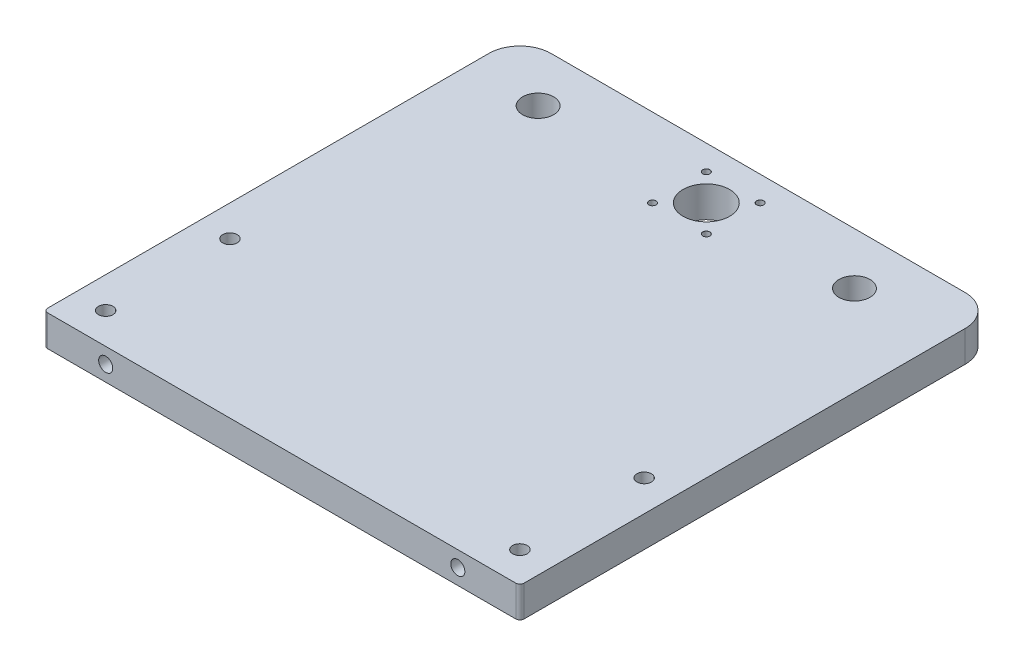
ISO-10303-21;
HEADER;
FILE_DESCRIPTION(('STEP AP214'),'2;1');
FILE_NAME('part.step','',(''),(''),'','','');
FILE_SCHEMA(('AUTOMOTIVE_DESIGN { 1 0 10303 214 1 1 1 1 }'));
ENDSEC;
DATA;
#1=APPLICATION_CONTEXT('core data for automotive mechanical design processes');
#2=APPLICATION_PROTOCOL_DEFINITION('international standard','automotive_design',2000,#1);
#3=PRODUCT_CONTEXT('',#1,'mechanical');
#4=PRODUCT('Part','Part','',(#3));
#5=PRODUCT_RELATED_PRODUCT_CATEGORY('part','',(#4));
#6=PRODUCT_DEFINITION_FORMATION('','',#4);
#7=PRODUCT_DEFINITION_CONTEXT('part definition',#1,'design');
#8=PRODUCT_DEFINITION('design','',#6,#7);
#9=PRODUCT_DEFINITION_SHAPE('','',#8);
#10=(LENGTH_UNIT() NAMED_UNIT(*) SI_UNIT(.MILLI.,.METRE.));
#11=(NAMED_UNIT(*) PLANE_ANGLE_UNIT() SI_UNIT($,.RADIAN.));
#12=(NAMED_UNIT(*) SI_UNIT($,.STERADIAN.) SOLID_ANGLE_UNIT());
#13=UNCERTAINTY_MEASURE_WITH_UNIT(LENGTH_MEASURE(1.E-05),#10,'distance_accuracy_value','');
#14=(GEOMETRIC_REPRESENTATION_CONTEXT(3) GLOBAL_UNCERTAINTY_ASSIGNED_CONTEXT((#13)) GLOBAL_UNIT_ASSIGNED_CONTEXT((#10,
#11,#12)) REPRESENTATION_CONTEXT('',''));
#15=CARTESIAN_POINT('',(0.,0.,0.));
#16=DIRECTION('',(0.,0.,1.));
#17=DIRECTION('',(1.,0.,0.));
#18=AXIS2_PLACEMENT_3D('',#15,#16,#17);
#19=CARTESIAN_POINT('',(-115.,15.,-115.));
#20=DIRECTION('',(1.,0.,0.));
#21=DIRECTION('',(0.,0.,-1.));
#22=AXIS2_PLACEMENT_3D('',#19,#20,#21);
#23=PLANE('',#22);
#24=DIRECTION('',(0.,0.,1.));
#25=VECTOR('',#24,1.);
#26=CARTESIAN_POINT('',(-115.,0.,-115.));
#27=LINE('',#26,#25);
#28=CARTESIAN_POINT('',(-115.,0.,-100.));
#29=VERTEX_POINT('',#28);
#30=CARTESIAN_POINT('',(-115.,0.,113.));
#31=VERTEX_POINT('',#30);
#32=EDGE_CURVE('E224',#29,#31,#27,.T.);
#33=ORIENTED_EDGE('',*,*,#32,.T.);
#34=DIRECTION('',(0.,-1.,0.));
#35=VECTOR('',#34,1.);
#36=CARTESIAN_POINT('',(-115.,15.,113.));
#37=LINE('',#36,#35);
#38=CARTESIAN_POINT('',(-115.,15.,113.));
#39=VERTEX_POINT('',#38);
#40=EDGE_CURVE('E11',#31,#39,#37,.F.);
#41=ORIENTED_EDGE('',*,*,#40,.T.);
#42=DIRECTION('',(0.,0.,1.));
#43=VECTOR('',#42,1.);
#44=CARTESIAN_POINT('',(-115.,15.,-115.));
#45=LINE('',#44,#43);
#46=CARTESIAN_POINT('',(-115.,15.,-100.));
#47=VERTEX_POINT('',#46);
#48=EDGE_CURVE('E225',#47,#39,#45,.T.);
#49=ORIENTED_EDGE('',*,*,#48,.F.);
#50=DIRECTION('',(0.,-1.,0.));
#51=VECTOR('',#50,1.);
#52=CARTESIAN_POINT('',(-115.,15.,-100.));
#53=LINE('',#52,#51);
#54=EDGE_CURVE('E262',#47,#29,#53,.T.);
#55=ORIENTED_EDGE('',*,*,#54,.T.);
#56=EDGE_LOOP('',(#33,#41,#49,#55));
#57=FACE_BOUND('',#56,.T.);
#58=ADVANCED_FACE('F41',(#57),#23,.F.);
#59=CARTESIAN_POINT('',(-115.,15.,115.));
#60=DIRECTION('',(0.,0.,-1.));
#61=DIRECTION('',(-1.,0.,0.));
#62=AXIS2_PLACEMENT_3D('',#59,#60,#61);
#63=PLANE('',#62);
#64=CARTESIAN_POINT('',(-85.,7.5,115.));
#65=DIRECTION('',(0.,0.,1.));
#66=DIRECTION('',(1.,0.,0.));
#67=AXIS2_PLACEMENT_3D('',#64,#65,#66);
#68=CIRCLE('',#67,3.39999999999999);
#69=CARTESIAN_POINT('',(-81.6,7.5,115.));
#70=VERTEX_POINT('',#69);
#71=EDGE_CURVE('E123',#70,#70,#68,.T.);
#72=ORIENTED_EDGE('',*,*,#71,.F.);
#73=EDGE_LOOP('',(#72));
#74=FACE_BOUND('',#73,.T.);
#75=CARTESIAN_POINT('',(85.,7.5,115.));
#76=DIRECTION('',(0.,0.,1.));
#77=DIRECTION('',(1.,0.,0.));
#78=AXIS2_PLACEMENT_3D('',#75,#76,#77);
#79=CIRCLE('',#78,3.39999999999999);
#80=CARTESIAN_POINT('',(88.4,7.5,115.));
#81=VERTEX_POINT('',#80);
#82=EDGE_CURVE('E122',#81,#81,#79,.T.);
#83=ORIENTED_EDGE('',*,*,#82,.F.);
#84=EDGE_LOOP('',(#83));
#85=FACE_BOUND('',#84,.T.);
#86=DIRECTION('',(1.,0.,0.));
#87=VECTOR('',#86,1.);
#88=CARTESIAN_POINT('',(-115.,0.,115.));
#89=LINE('',#88,#87);
#90=CARTESIAN_POINT('',(-113.,0.,115.));
#91=VERTEX_POINT('',#90);
#92=CARTESIAN_POINT('',(113.,0.,115.));
#93=VERTEX_POINT('',#92);
#94=EDGE_CURVE('E238',#91,#93,#89,.T.);
#95=ORIENTED_EDGE('',*,*,#94,.T.);
#96=DIRECTION('',(0.,-1.,0.));
#97=VECTOR('',#96,1.);
#98=CARTESIAN_POINT('',(113.,15.,115.));
#99=LINE('',#98,#97);
#100=CARTESIAN_POINT('',(113.,15.,115.));
#101=VERTEX_POINT('',#100);
#102=EDGE_CURVE('E62',#93,#101,#99,.F.);
#103=ORIENTED_EDGE('',*,*,#102,.T.);
#104=DIRECTION('',(1.,0.,0.));
#105=VECTOR('',#104,1.);
#106=CARTESIAN_POINT('',(-115.,15.,115.));
#107=LINE('',#106,#105);
#108=CARTESIAN_POINT('',(-113.,15.,115.));
#109=VERTEX_POINT('',#108);
#110=EDGE_CURVE('E227',#109,#101,#107,.T.);
#111=ORIENTED_EDGE('',*,*,#110,.F.);
#112=DIRECTION('',(0.,-1.,0.));
#113=VECTOR('',#112,1.);
#114=CARTESIAN_POINT('',(-113.,15.,115.));
#115=LINE('',#114,#113);
#116=EDGE_CURVE('E272',#109,#91,#115,.T.);
#117=ORIENTED_EDGE('',*,*,#116,.T.);
#118=EDGE_LOOP('',(#95,#103,#111,#117));
#119=FACE_BOUND('',#118,.T.);
#120=ADVANCED_FACE('F292',(#74,#85,#119),#63,.F.);
#121=CARTESIAN_POINT('',(115.,15.,-115.));
#122=DIRECTION('',(-1.,0.,0.));
#123=DIRECTION('',(0.,0.,1.));
#124=AXIS2_PLACEMENT_3D('',#121,#122,#123);
#125=PLANE('',#124);
#126=DIRECTION('',(0.,0.,-1.));
#127=VECTOR('',#126,1.);
#128=CARTESIAN_POINT('',(115.,15.,-115.));
#129=LINE('',#128,#127);
#130=CARTESIAN_POINT('',(115.,15.,113.));
#131=VERTEX_POINT('',#130);
#132=CARTESIAN_POINT('',(115.,15.,-100.));
#133=VERTEX_POINT('',#132);
#134=EDGE_CURVE('E231',#131,#133,#129,.T.);
#135=ORIENTED_EDGE('',*,*,#134,.F.);
#136=DIRECTION('',(0.,-1.,0.));
#137=VECTOR('',#136,1.);
#138=CARTESIAN_POINT('',(115.,15.,113.));
#139=LINE('',#138,#137);
#140=CARTESIAN_POINT('',(115.,0.,113.));
#141=VERTEX_POINT('',#140);
#142=EDGE_CURVE('E265',#131,#141,#139,.T.);
#143=ORIENTED_EDGE('',*,*,#142,.T.);
#144=DIRECTION('',(0.,0.,-1.));
#145=VECTOR('',#144,1.);
#146=CARTESIAN_POINT('',(115.,0.,-115.));
#147=LINE('',#146,#145);
#148=CARTESIAN_POINT('',(115.,0.,-100.));
#149=VERTEX_POINT('',#148);
#150=EDGE_CURVE('E241',#141,#149,#147,.T.);
#151=ORIENTED_EDGE('',*,*,#150,.T.);
#152=DIRECTION('',(0.,-1.,0.));
#153=VECTOR('',#152,1.);
#154=CARTESIAN_POINT('',(115.,15.,-100.));
#155=LINE('',#154,#153);
#156=EDGE_CURVE('E255',#149,#133,#155,.F.);
#157=ORIENTED_EDGE('',*,*,#156,.T.);
#158=EDGE_LOOP('',(#135,#143,#151,#157));
#159=FACE_BOUND('',#158,.T.);
#160=ADVANCED_FACE('F284',(#159),#125,.F.);
#161=CARTESIAN_POINT('',(-115.,15.,-115.));
#162=DIRECTION('',(0.,0.,1.));
#163=DIRECTION('',(1.,0.,0.));
#164=AXIS2_PLACEMENT_3D('',#161,#162,#163);
#165=PLANE('',#164);
#166=DIRECTION('',(-1.,0.,0.));
#167=VECTOR('',#166,1.);
#168=CARTESIAN_POINT('',(-115.,15.,-115.));
#169=LINE('',#168,#167);
#170=CARTESIAN_POINT('',(100.,15.,-115.));
#171=VERTEX_POINT('',#170);
#172=CARTESIAN_POINT('',(-100.,15.,-115.));
#173=VERTEX_POINT('',#172);
#174=EDGE_CURVE('E233',#171,#173,#169,.T.);
#175=ORIENTED_EDGE('',*,*,#174,.F.);
#176=DIRECTION('',(0.,-1.,0.));
#177=VECTOR('',#176,1.);
#178=CARTESIAN_POINT('',(100.,15.,-115.));
#179=LINE('',#178,#177);
#180=CARTESIAN_POINT('',(100.,0.,-115.));
#181=VERTEX_POINT('',#180);
#182=EDGE_CURVE('E247',#171,#181,#179,.T.);
#183=ORIENTED_EDGE('',*,*,#182,.T.);
#184=DIRECTION('',(-1.,0.,0.));
#185=VECTOR('',#184,1.);
#186=CARTESIAN_POINT('',(-115.,0.,-115.));
#187=LINE('',#186,#185);
#188=CARTESIAN_POINT('',(-100.,0.,-115.));
#189=VERTEX_POINT('',#188);
#190=EDGE_CURVE('E228',#181,#189,#187,.T.);
#191=ORIENTED_EDGE('',*,*,#190,.T.);
#192=DIRECTION('',(0.,-1.,0.));
#193=VECTOR('',#192,1.);
#194=CARTESIAN_POINT('',(-100.,15.,-115.));
#195=LINE('',#194,#193);
#196=EDGE_CURVE('E236',#189,#173,#195,.F.);
#197=ORIENTED_EDGE('',*,*,#196,.T.);
#198=EDGE_LOOP('',(#175,#183,#191,#197));
#199=FACE_BOUND('',#198,.T.);
#200=ADVANCED_FACE('F305',(#199),#165,.F.);
#201=CARTESIAN_POINT('',(0.,15.,0.));
#202=DIRECTION('',(0.,1.,0.));
#203=DIRECTION('',(0.,0.,1.));
#204=AXIS2_PLACEMENT_3D('',#201,#202,#203);
#205=PLANE('',#204);
#206=CARTESIAN_POINT('',(-100.,15.,40.));
#207=DIRECTION('',(0.,1.,0.));
#208=DIRECTION('',(0.,0.,1.));
#209=AXIS2_PLACEMENT_3D('',#206,#207,#208);
#210=CIRCLE('',#209,3.49999999999999);
#211=CARTESIAN_POINT('',(-100.,15.,43.5));
#212=VERTEX_POINT('',#211);
#213=EDGE_CURVE('E133',#212,#212,#210,.T.);
#214=ORIENTED_EDGE('',*,*,#213,.F.);
#215=EDGE_LOOP('',(#214));
#216=FACE_BOUND('',#215,.T.);
#217=CARTESIAN_POINT('',(-100.,15.,100.));
#218=DIRECTION('',(0.,1.,0.));
#219=DIRECTION('',(0.,0.,1.));
#220=AXIS2_PLACEMENT_3D('',#217,#218,#219);
#221=CIRCLE('',#220,3.49999999999999);
#222=CARTESIAN_POINT('',(-100.,15.,103.5));
#223=VERTEX_POINT('',#222);
#224=EDGE_CURVE('E139',#223,#223,#221,.T.);
#225=ORIENTED_EDGE('',*,*,#224,.F.);
#226=EDGE_LOOP('',(#225));
#227=FACE_BOUND('',#226,.T.);
#228=CARTESIAN_POINT('',(100.,15.,40.));
#229=DIRECTION('',(0.,1.,0.));
#230=DIRECTION('',(0.,0.,1.));
#231=AXIS2_PLACEMENT_3D('',#228,#229,#230);
#232=CIRCLE('',#231,3.49999999999999);
#233=CARTESIAN_POINT('',(100.,15.,43.5));
#234=VERTEX_POINT('',#233);
#235=EDGE_CURVE('E145',#234,#234,#232,.T.);
#236=ORIENTED_EDGE('',*,*,#235,.F.);
#237=EDGE_LOOP('',(#236));
#238=FACE_BOUND('',#237,.T.);
#239=CARTESIAN_POINT('',(100.,15.,100.));
#240=DIRECTION('',(0.,1.,0.));
#241=DIRECTION('',(0.,0.,1.));
#242=AXIS2_PLACEMENT_3D('',#239,#240,#241);
#243=CIRCLE('',#242,3.49999999999999);
#244=CARTESIAN_POINT('',(100.,15.,103.5));
#245=VERTEX_POINT('',#244);
#246=EDGE_CURVE('E151',#245,#245,#243,.T.);
#247=ORIENTED_EDGE('',*,*,#246,.F.);
#248=EDGE_LOOP('',(#247));
#249=FACE_BOUND('',#248,.T.);
#250=CARTESIAN_POINT('',(0.,15.,-90.));
#251=DIRECTION('',(0.,1.,0.));
#252=DIRECTION('',(0.,0.,1.));
#253=AXIS2_PLACEMENT_3D('',#250,#251,#252);
#254=CIRCLE('',#253,11.25);
#255=CARTESIAN_POINT('',(0.,15.,-78.75));
#256=VERTEX_POINT('',#255);
#257=EDGE_CURVE('E157',#256,#256,#254,.T.);
#258=ORIENTED_EDGE('',*,*,#257,.F.);
#259=EDGE_LOOP('',(#258));
#260=FACE_BOUND('',#259,.T.);
#261=CARTESIAN_POINT('',(-13.,15.,-103.));
#262=DIRECTION('',(0.,1.,0.));
#263=DIRECTION('',(0.,0.,1.));
#264=AXIS2_PLACEMENT_3D('',#261,#262,#263);
#265=CIRCLE('',#264,1.725);
#266=CARTESIAN_POINT('',(-13.,15.,-101.275));
#267=VERTEX_POINT('',#266);
#268=EDGE_CURVE('E166',#267,#267,#265,.T.);
#269=ORIENTED_EDGE('',*,*,#268,.F.);
#270=EDGE_LOOP('',(#269));
#271=FACE_BOUND('',#270,.T.);
#272=CARTESIAN_POINT('',(13.,15.,-103.));
#273=DIRECTION('',(0.,1.,0.));
#274=DIRECTION('',(0.,0.,1.));
#275=AXIS2_PLACEMENT_3D('',#272,#273,#274);
#276=CIRCLE('',#275,1.725);
#277=CARTESIAN_POINT('',(13.,15.,-101.275));
#278=VERTEX_POINT('',#277);
#279=EDGE_CURVE('E178',#278,#278,#276,.T.);
#280=ORIENTED_EDGE('',*,*,#279,.F.);
#281=EDGE_LOOP('',(#280));
#282=FACE_BOUND('',#281,.T.);
#283=CARTESIAN_POINT('',(-13.,15.,-77.));
#284=DIRECTION('',(0.,1.,0.));
#285=DIRECTION('',(0.,0.,1.));
#286=AXIS2_PLACEMENT_3D('',#283,#284,#285);
#287=CIRCLE('',#286,1.725);
#288=CARTESIAN_POINT('',(-13.,15.,-75.275));
#289=VERTEX_POINT('',#288);
#290=EDGE_CURVE('E190',#289,#289,#287,.T.);
#291=ORIENTED_EDGE('',*,*,#290,.F.);
#292=EDGE_LOOP('',(#291));
#293=FACE_BOUND('',#292,.T.);
#294=CARTESIAN_POINT('',(13.,15.,-77.));
#295=DIRECTION('',(0.,1.,0.));
#296=DIRECTION('',(0.,0.,1.));
#297=AXIS2_PLACEMENT_3D('',#294,#295,#296);
#298=CIRCLE('',#297,1.725);
#299=CARTESIAN_POINT('',(13.,15.,-75.275));
#300=VERTEX_POINT('',#299);
#301=EDGE_CURVE('E202',#300,#300,#298,.T.);
#302=ORIENTED_EDGE('',*,*,#301,.F.);
#303=EDGE_LOOP('',(#302));
#304=FACE_BOUND('',#303,.T.);
#305=CARTESIAN_POINT('',(-81.2230396091657,15.,-90.));
#306=DIRECTION('',(0.,1.,0.));
#307=DIRECTION('',(0.,0.,1.));
#308=AXIS2_PLACEMENT_3D('',#305,#306,#307);
#309=CIRCLE('',#308,7.49999999999999);
#310=CARTESIAN_POINT('',(-81.2230396091657,15.,-82.5));
#311=VERTEX_POINT('',#310);
#312=EDGE_CURVE('E211',#311,#311,#309,.T.);
#313=ORIENTED_EDGE('',*,*,#312,.F.);
#314=EDGE_LOOP('',(#313));
#315=FACE_BOUND('',#314,.T.);
#316=CARTESIAN_POINT('',(71.5255366539158,15.,-90.));
#317=DIRECTION('',(0.,1.,0.));
#318=DIRECTION('',(0.,0.,1.));
#319=AXIS2_PLACEMENT_3D('',#316,#317,#318);
#320=CIRCLE('',#319,7.49999999999999);
#321=CARTESIAN_POINT('',(71.5255366539158,15.,-82.5));
#322=VERTEX_POINT('',#321);
#323=EDGE_CURVE('E218',#322,#322,#320,.T.);
#324=ORIENTED_EDGE('',*,*,#323,.F.);
#325=EDGE_LOOP('',(#324));
#326=FACE_BOUND('',#325,.T.);
#327=ORIENTED_EDGE('',*,*,#110,.T.);
#328=CARTESIAN_POINT('',(113.,15.,113.));
#329=DIRECTION('',(0.,1.,0.));
#330=DIRECTION('',(0.,0.,1.));
#331=AXIS2_PLACEMENT_3D('',#328,#329,#330);
#332=CIRCLE('',#331,2.);
#333=EDGE_CURVE('E49',#101,#131,#332,.T.);
#334=ORIENTED_EDGE('',*,*,#333,.T.);
#335=ORIENTED_EDGE('',*,*,#134,.T.);
#336=CARTESIAN_POINT('',(100.,15.,-100.));
#337=DIRECTION('',(0.,1.,0.));
#338=DIRECTION('',(0.,0.,1.));
#339=AXIS2_PLACEMENT_3D('',#336,#337,#338);
#340=CIRCLE('',#339,15.);
#341=EDGE_CURVE('E260',#133,#171,#340,.T.);
#342=ORIENTED_EDGE('',*,*,#341,.T.);
#343=ORIENTED_EDGE('',*,*,#174,.T.);
#344=CARTESIAN_POINT('',(-100.,15.,-100.));
#345=DIRECTION('',(0.,1.,0.));
#346=DIRECTION('',(0.,0.,1.));
#347=AXIS2_PLACEMENT_3D('',#344,#345,#346);
#348=CIRCLE('',#347,15.);
#349=EDGE_CURVE('E258',#173,#47,#348,.T.);
#350=ORIENTED_EDGE('',*,*,#349,.T.);
#351=ORIENTED_EDGE('',*,*,#48,.T.);
#352=CARTESIAN_POINT('',(-113.,15.,113.));
#353=DIRECTION('',(0.,1.,0.));
#354=DIRECTION('',(0.,0.,1.));
#355=AXIS2_PLACEMENT_3D('',#352,#353,#354);
#356=CIRCLE('',#355,2.);
#357=EDGE_CURVE('E276',#39,#109,#356,.T.);
#358=ORIENTED_EDGE('',*,*,#357,.T.);
#359=EDGE_LOOP('',(#327,#334,#335,#342,#343,#350,#351,#358));
#360=FACE_BOUND('',#359,.T.);
#361=ADVANCED_FACE('F280',(#216,#227,#238,#249,#260,#271,#282,#293,#304,#315,#326,#360),#205,.T.);
#362=CARTESIAN_POINT('',(0.,0.,0.));
#363=DIRECTION('',(0.,1.,0.));
#364=DIRECTION('',(0.,0.,1.));
#365=AXIS2_PLACEMENT_3D('',#362,#363,#364);
#366=PLANE('',#365);
#367=CARTESIAN_POINT('',(-100.,0.,40.));
#368=DIRECTION('',(0.,1.,0.));
#369=DIRECTION('',(0.,0.,1.));
#370=AXIS2_PLACEMENT_3D('',#367,#368,#369);
#371=CIRCLE('',#370,3.49999999999999);
#372=CARTESIAN_POINT('',(-100.,0.,43.5));
#373=VERTEX_POINT('',#372);
#374=EDGE_CURVE('E136',#373,#373,#371,.T.);
#375=ORIENTED_EDGE('',*,*,#374,.T.);
#376=EDGE_LOOP('',(#375));
#377=FACE_BOUND('',#376,.T.);
#378=CARTESIAN_POINT('',(-100.,0.,100.));
#379=DIRECTION('',(0.,1.,0.));
#380=DIRECTION('',(0.,0.,1.));
#381=AXIS2_PLACEMENT_3D('',#378,#379,#380);
#382=CIRCLE('',#381,3.49999999999999);
#383=CARTESIAN_POINT('',(-100.,0.,103.5));
#384=VERTEX_POINT('',#383);
#385=EDGE_CURVE('E142',#384,#384,#382,.T.);
#386=ORIENTED_EDGE('',*,*,#385,.T.);
#387=EDGE_LOOP('',(#386));
#388=FACE_BOUND('',#387,.T.);
#389=CARTESIAN_POINT('',(100.,0.,40.));
#390=DIRECTION('',(0.,1.,0.));
#391=DIRECTION('',(0.,0.,1.));
#392=AXIS2_PLACEMENT_3D('',#389,#390,#391);
#393=CIRCLE('',#392,3.49999999999999);
#394=CARTESIAN_POINT('',(100.,0.,43.5));
#395=VERTEX_POINT('',#394);
#396=EDGE_CURVE('E148',#395,#395,#393,.T.);
#397=ORIENTED_EDGE('',*,*,#396,.T.);
#398=EDGE_LOOP('',(#397));
#399=FACE_BOUND('',#398,.T.);
#400=CARTESIAN_POINT('',(100.,0.,100.));
#401=DIRECTION('',(0.,1.,0.));
#402=DIRECTION('',(0.,0.,1.));
#403=AXIS2_PLACEMENT_3D('',#400,#401,#402);
#404=CIRCLE('',#403,3.49999999999999);
#405=CARTESIAN_POINT('',(100.,0.,103.5));
#406=VERTEX_POINT('',#405);
#407=EDGE_CURVE('E154',#406,#406,#404,.T.);
#408=ORIENTED_EDGE('',*,*,#407,.T.);
#409=EDGE_LOOP('',(#408));
#410=FACE_BOUND('',#409,.T.);
#411=CARTESIAN_POINT('',(0.,0.,-90.));
#412=DIRECTION('',(0.,1.,0.));
#413=DIRECTION('',(0.,0.,1.));
#414=AXIS2_PLACEMENT_3D('',#411,#412,#413);
#415=CIRCLE('',#414,11.25);
#416=CARTESIAN_POINT('',(0.,0.,-78.75));
#417=VERTEX_POINT('',#416);
#418=EDGE_CURVE('E160',#417,#417,#415,.T.);
#419=ORIENTED_EDGE('',*,*,#418,.T.);
#420=EDGE_LOOP('',(#419));
#421=FACE_BOUND('',#420,.T.);
#422=CARTESIAN_POINT('',(-13.,0.,-103.));
#423=DIRECTION('',(0.,1.,0.));
#424=DIRECTION('',(0.,0.,1.));
#425=AXIS2_PLACEMENT_3D('',#422,#423,#424);
#426=CIRCLE('',#425,1.725);
#427=CARTESIAN_POINT('',(-13.,0.,-101.275));
#428=VERTEX_POINT('',#427);
#429=EDGE_CURVE('E163',#428,#428,#426,.T.);
#430=ORIENTED_EDGE('',*,*,#429,.T.);
#431=EDGE_LOOP('',(#430));
#432=FACE_BOUND('',#431,.T.);
#433=CARTESIAN_POINT('',(13.,0.,-103.));
#434=DIRECTION('',(0.,1.,0.));
#435=DIRECTION('',(0.,0.,1.));
#436=AXIS2_PLACEMENT_3D('',#433,#434,#435);
#437=CIRCLE('',#436,1.725);
#438=CARTESIAN_POINT('',(13.,0.,-101.275));
#439=VERTEX_POINT('',#438);
#440=EDGE_CURVE('E175',#439,#439,#437,.T.);
#441=ORIENTED_EDGE('',*,*,#440,.T.);
#442=EDGE_LOOP('',(#441));
#443=FACE_BOUND('',#442,.T.);
#444=CARTESIAN_POINT('',(-13.,0.,-77.));
#445=DIRECTION('',(0.,1.,0.));
#446=DIRECTION('',(0.,0.,1.));
#447=AXIS2_PLACEMENT_3D('',#444,#445,#446);
#448=CIRCLE('',#447,1.725);
#449=CARTESIAN_POINT('',(-13.,0.,-75.275));
#450=VERTEX_POINT('',#449);
#451=EDGE_CURVE('E187',#450,#450,#448,.T.);
#452=ORIENTED_EDGE('',*,*,#451,.T.);
#453=EDGE_LOOP('',(#452));
#454=FACE_BOUND('',#453,.T.);
#455=CARTESIAN_POINT('',(13.,0.,-77.));
#456=DIRECTION('',(0.,1.,0.));
#457=DIRECTION('',(0.,0.,1.));
#458=AXIS2_PLACEMENT_3D('',#455,#456,#457);
#459=CIRCLE('',#458,1.725);
#460=CARTESIAN_POINT('',(13.,0.,-75.275));
#461=VERTEX_POINT('',#460);
#462=EDGE_CURVE('E199',#461,#461,#459,.T.);
#463=ORIENTED_EDGE('',*,*,#462,.T.);
#464=EDGE_LOOP('',(#463));
#465=FACE_BOUND('',#464,.T.);
#466=CARTESIAN_POINT('',(-81.2230396091657,0.,-90.));
#467=DIRECTION('',(0.,1.,0.));
#468=DIRECTION('',(0.,0.,1.));
#469=AXIS2_PLACEMENT_3D('',#466,#467,#468);
#470=CIRCLE('',#469,7.49999999999999);
#471=CARTESIAN_POINT('',(-81.2230396091657,0.,-82.5));
#472=VERTEX_POINT('',#471);
#473=EDGE_CURVE('E214',#472,#472,#470,.T.);
#474=ORIENTED_EDGE('',*,*,#473,.T.);
#475=EDGE_LOOP('',(#474));
#476=FACE_BOUND('',#475,.T.);
#477=CARTESIAN_POINT('',(71.5255366539158,0.,-90.));
#478=DIRECTION('',(0.,1.,0.));
#479=DIRECTION('',(0.,0.,1.));
#480=AXIS2_PLACEMENT_3D('',#477,#478,#479);
#481=CIRCLE('',#480,7.49999999999999);
#482=CARTESIAN_POINT('',(71.5255366539158,0.,-82.5));
#483=VERTEX_POINT('',#482);
#484=EDGE_CURVE('E221',#483,#483,#481,.T.);
#485=ORIENTED_EDGE('',*,*,#484,.T.);
#486=EDGE_LOOP('',(#485));
#487=FACE_BOUND('',#486,.T.);
#488=ORIENTED_EDGE('',*,*,#150,.F.);
#489=CARTESIAN_POINT('',(113.,0.,113.));
#490=DIRECTION('',(0.,1.,0.));
#491=DIRECTION('',(0.,0.,1.));
#492=AXIS2_PLACEMENT_3D('',#489,#490,#491);
#493=CIRCLE('',#492,2.);
#494=EDGE_CURVE('E270',#141,#93,#493,.F.);
#495=ORIENTED_EDGE('',*,*,#494,.T.);
#496=ORIENTED_EDGE('',*,*,#94,.F.);
#497=CARTESIAN_POINT('',(-113.,0.,113.));
#498=DIRECTION('',(0.,1.,0.));
#499=DIRECTION('',(0.,0.,1.));
#500=AXIS2_PLACEMENT_3D('',#497,#498,#499);
#501=CIRCLE('',#500,2.);
#502=EDGE_CURVE('E268',#91,#31,#501,.F.);
#503=ORIENTED_EDGE('',*,*,#502,.T.);
#504=ORIENTED_EDGE('',*,*,#32,.F.);
#505=CARTESIAN_POINT('',(-100.,0.,-100.));
#506=DIRECTION('',(0.,1.,0.));
#507=DIRECTION('',(0.,0.,1.));
#508=AXIS2_PLACEMENT_3D('',#505,#506,#507);
#509=CIRCLE('',#508,15.);
#510=EDGE_CURVE('E250',#29,#189,#509,.F.);
#511=ORIENTED_EDGE('',*,*,#510,.T.);
#512=ORIENTED_EDGE('',*,*,#190,.F.);
#513=CARTESIAN_POINT('',(100.,0.,-100.));
#514=DIRECTION('',(0.,1.,0.));
#515=DIRECTION('',(0.,0.,1.));
#516=AXIS2_PLACEMENT_3D('',#513,#514,#515);
#517=CIRCLE('',#516,15.);
#518=EDGE_CURVE('E252',#181,#149,#517,.F.);
#519=ORIENTED_EDGE('',*,*,#518,.T.);
#520=EDGE_LOOP('',(#488,#495,#496,#503,#504,#511,#512,#519));
#521=FACE_BOUND('',#520,.T.);
#522=ADVANCED_FACE('F291',(#377,#388,#399,#410,#421,#432,#443,#454,#465,#476,#487,#521),#366,.F.);
#523=CARTESIAN_POINT('',(71.5255366539158,15.,-90.));
#524=DIRECTION('',(0.,1.,0.));
#525=DIRECTION('',(0.,0.,1.));
#526=AXIS2_PLACEMENT_3D('',#523,#524,#525);
#527=CYLINDRICAL_SURFACE('',#526,7.49999999999999);
#528=ORIENTED_EDGE('',*,*,#484,.F.);
#529=EDGE_LOOP('',(#528));
#530=FACE_BOUND('',#529,.T.);
#531=ORIENTED_EDGE('',*,*,#323,.T.);
#532=EDGE_LOOP('',(#531));
#533=FACE_BOUND('',#532,.T.);
#534=ADVANCED_FACE('F334',(#530,#533),#527,.F.);
#535=CARTESIAN_POINT('',(-81.2230396091657,15.,-90.));
#536=DIRECTION('',(0.,1.,0.));
#537=DIRECTION('',(0.,0.,1.));
#538=AXIS2_PLACEMENT_3D('',#535,#536,#537);
#539=CYLINDRICAL_SURFACE('',#538,7.49999999999999);
#540=ORIENTED_EDGE('',*,*,#473,.F.);
#541=EDGE_LOOP('',(#540));
#542=FACE_BOUND('',#541,.T.);
#543=ORIENTED_EDGE('',*,*,#312,.T.);
#544=EDGE_LOOP('',(#543));
#545=FACE_BOUND('',#544,.T.);
#546=ADVANCED_FACE('F341',(#542,#545),#539,.F.);
#547=CARTESIAN_POINT('',(13.,0.024999999999999,-77.));
#548=DIRECTION('',(0.,-1.,0.));
#549=DIRECTION('',(0.,0.,-1.));
#550=AXIS2_PLACEMENT_3D('',#547,#548,#549);
#551=CONICAL_SURFACE('',#550,1.7,0.785398163397448);
#552=ORIENTED_EDGE('',*,*,#462,.F.);
#553=EDGE_LOOP('',(#552));
#554=FACE_BOUND('',#553,.T.);
#555=CARTESIAN_POINT('',(13.,0.024999999999999,-77.));
#556=DIRECTION('',(0.,1.,0.));
#557=DIRECTION('',(0.,0.,1.));
#558=AXIS2_PLACEMENT_3D('',#555,#556,#557);
#559=CIRCLE('',#558,1.7);
#560=CARTESIAN_POINT('',(13.,0.024999999999999,-75.3));
#561=VERTEX_POINT('',#560);
#562=EDGE_CURVE('E208',#561,#561,#559,.T.);
#563=ORIENTED_EDGE('',*,*,#562,.T.);
#564=EDGE_LOOP('',(#563));
#565=FACE_BOUND('',#564,.T.);
#566=ADVANCED_FACE('F345',(#554,#565),#551,.F.);
#567=CARTESIAN_POINT('',(13.,15.,-77.));
#568=DIRECTION('',(0.,1.,0.));
#569=DIRECTION('',(0.,0.,1.));
#570=AXIS2_PLACEMENT_3D('',#567,#568,#569);
#571=CYLINDRICAL_SURFACE('',#570,1.7);
#572=ORIENTED_EDGE('',*,*,#562,.F.);
#573=EDGE_LOOP('',(#572));
#574=FACE_BOUND('',#573,.T.);
#575=CARTESIAN_POINT('',(13.,14.975,-77.));
#576=DIRECTION('',(0.,1.,0.));
#577=DIRECTION('',(0.,0.,1.));
#578=AXIS2_PLACEMENT_3D('',#575,#576,#577);
#579=CIRCLE('',#578,1.7);
#580=CARTESIAN_POINT('',(13.,14.975,-75.3));
#581=VERTEX_POINT('',#580);
#582=EDGE_CURVE('E205',#581,#581,#579,.T.);
#583=ORIENTED_EDGE('',*,*,#582,.T.);
#584=EDGE_LOOP('',(#583));
#585=FACE_BOUND('',#584,.T.);
#586=ADVANCED_FACE('F349',(#574,#585),#571,.F.);
#587=CARTESIAN_POINT('',(13.,15.,-77.));
#588=DIRECTION('',(0.,1.,0.));
#589=DIRECTION('',(0.,0.,1.));
#590=AXIS2_PLACEMENT_3D('',#587,#588,#589);
#591=CONICAL_SURFACE('',#590,1.725,0.785398163397414);
#592=ORIENTED_EDGE('',*,*,#582,.F.);
#593=EDGE_LOOP('',(#592));
#594=FACE_BOUND('',#593,.T.);
#595=ORIENTED_EDGE('',*,*,#301,.T.);
#596=EDGE_LOOP('',(#595));
#597=FACE_BOUND('',#596,.T.);
#598=ADVANCED_FACE('F353',(#594,#597),#591,.F.);
#599=CARTESIAN_POINT('',(-13.,0.024999999999999,-77.));
#600=DIRECTION('',(0.,-1.,0.));
#601=DIRECTION('',(0.,0.,-1.));
#602=AXIS2_PLACEMENT_3D('',#599,#600,#601);
#603=CONICAL_SURFACE('',#602,1.7,0.785398163397448);
#604=ORIENTED_EDGE('',*,*,#451,.F.);
#605=EDGE_LOOP('',(#604));
#606=FACE_BOUND('',#605,.T.);
#607=CARTESIAN_POINT('',(-13.,0.024999999999999,-77.));
#608=DIRECTION('',(0.,1.,0.));
#609=DIRECTION('',(0.,0.,1.));
#610=AXIS2_PLACEMENT_3D('',#607,#608,#609);
#611=CIRCLE('',#610,1.7);
#612=CARTESIAN_POINT('',(-13.,0.024999999999999,-75.3));
#613=VERTEX_POINT('',#612);
#614=EDGE_CURVE('E196',#613,#613,#611,.T.);
#615=ORIENTED_EDGE('',*,*,#614,.T.);
#616=EDGE_LOOP('',(#615));
#617=FACE_BOUND('',#616,.T.);
#618=ADVANCED_FACE('F357',(#606,#617),#603,.F.);
#619=CARTESIAN_POINT('',(-13.,15.,-77.));
#620=DIRECTION('',(0.,1.,0.));
#621=DIRECTION('',(0.,0.,1.));
#622=AXIS2_PLACEMENT_3D('',#619,#620,#621);
#623=CYLINDRICAL_SURFACE('',#622,1.7);
#624=ORIENTED_EDGE('',*,*,#614,.F.);
#625=EDGE_LOOP('',(#624));
#626=FACE_BOUND('',#625,.T.);
#627=CARTESIAN_POINT('',(-13.,14.975,-77.));
#628=DIRECTION('',(0.,1.,0.));
#629=DIRECTION('',(0.,0.,1.));
#630=AXIS2_PLACEMENT_3D('',#627,#628,#629);
#631=CIRCLE('',#630,1.7);
#632=CARTESIAN_POINT('',(-13.,14.975,-75.3));
#633=VERTEX_POINT('',#632);
#634=EDGE_CURVE('E193',#633,#633,#631,.T.);
#635=ORIENTED_EDGE('',*,*,#634,.T.);
#636=EDGE_LOOP('',(#635));
#637=FACE_BOUND('',#636,.T.);
#638=ADVANCED_FACE('F361',(#626,#637),#623,.F.);
#639=CARTESIAN_POINT('',(-13.,15.,-77.));
#640=DIRECTION('',(0.,1.,0.));
#641=DIRECTION('',(0.,0.,1.));
#642=AXIS2_PLACEMENT_3D('',#639,#640,#641);
#643=CONICAL_SURFACE('',#642,1.725,0.785398163397414);
#644=ORIENTED_EDGE('',*,*,#634,.F.);
#645=EDGE_LOOP('',(#644));
#646=FACE_BOUND('',#645,.T.);
#647=ORIENTED_EDGE('',*,*,#290,.T.);
#648=EDGE_LOOP('',(#647));
#649=FACE_BOUND('',#648,.T.);
#650=ADVANCED_FACE('F365',(#646,#649),#643,.F.);
#651=CARTESIAN_POINT('',(13.,0.024999999999999,-103.));
#652=DIRECTION('',(0.,-1.,0.));
#653=DIRECTION('',(0.,0.,-1.));
#654=AXIS2_PLACEMENT_3D('',#651,#652,#653);
#655=CONICAL_SURFACE('',#654,1.7,0.785398163397483);
#656=ORIENTED_EDGE('',*,*,#440,.F.);
#657=EDGE_LOOP('',(#656));
#658=FACE_BOUND('',#657,.T.);
#659=CARTESIAN_POINT('',(13.,0.024999999999999,-103.));
#660=DIRECTION('',(0.,1.,0.));
#661=DIRECTION('',(0.,0.,1.));
#662=AXIS2_PLACEMENT_3D('',#659,#660,#661);
#663=CIRCLE('',#662,1.7);
#664=CARTESIAN_POINT('',(13.,0.024999999999999,-101.3));
#665=VERTEX_POINT('',#664);
#666=EDGE_CURVE('E184',#665,#665,#663,.T.);
#667=ORIENTED_EDGE('',*,*,#666,.T.);
#668=EDGE_LOOP('',(#667));
#669=FACE_BOUND('',#668,.T.);
#670=ADVANCED_FACE('F369',(#658,#669),#655,.F.);
#671=CARTESIAN_POINT('',(13.,15.,-103.));
#672=DIRECTION('',(0.,1.,0.));
#673=DIRECTION('',(0.,0.,1.));
#674=AXIS2_PLACEMENT_3D('',#671,#672,#673);
#675=CYLINDRICAL_SURFACE('',#674,1.7);
#676=ORIENTED_EDGE('',*,*,#666,.F.);
#677=EDGE_LOOP('',(#676));
#678=FACE_BOUND('',#677,.T.);
#679=CARTESIAN_POINT('',(13.,14.975,-103.));
#680=DIRECTION('',(0.,1.,0.));
#681=DIRECTION('',(0.,0.,1.));
#682=AXIS2_PLACEMENT_3D('',#679,#680,#681);
#683=CIRCLE('',#682,1.7);
#684=CARTESIAN_POINT('',(13.,14.975,-101.3));
#685=VERTEX_POINT('',#684);
#686=EDGE_CURVE('E181',#685,#685,#683,.T.);
#687=ORIENTED_EDGE('',*,*,#686,.T.);
#688=EDGE_LOOP('',(#687));
#689=FACE_BOUND('',#688,.T.);
#690=ADVANCED_FACE('F373',(#678,#689),#675,.F.);
#691=CARTESIAN_POINT('',(13.,15.,-103.));
#692=DIRECTION('',(0.,1.,0.));
#693=DIRECTION('',(0.,0.,1.));
#694=AXIS2_PLACEMENT_3D('',#691,#692,#693);
#695=CONICAL_SURFACE('',#694,1.725,0.785398163397414);
#696=ORIENTED_EDGE('',*,*,#686,.F.);
#697=EDGE_LOOP('',(#696));
#698=FACE_BOUND('',#697,.T.);
#699=ORIENTED_EDGE('',*,*,#279,.T.);
#700=EDGE_LOOP('',(#699));
#701=FACE_BOUND('',#700,.T.);
#702=ADVANCED_FACE('F377',(#698,#701),#695,.F.);
#703=CARTESIAN_POINT('',(-13.,0.024999999999999,-103.));
#704=DIRECTION('',(0.,-1.,0.));
#705=DIRECTION('',(0.,0.,-1.));
#706=AXIS2_PLACEMENT_3D('',#703,#704,#705);
#707=CONICAL_SURFACE('',#706,1.7,0.785398163397483);
#708=ORIENTED_EDGE('',*,*,#429,.F.);
#709=EDGE_LOOP('',(#708));
#710=FACE_BOUND('',#709,.T.);
#711=CARTESIAN_POINT('',(-13.,0.024999999999999,-103.));
#712=DIRECTION('',(0.,1.,0.));
#713=DIRECTION('',(0.,0.,1.));
#714=AXIS2_PLACEMENT_3D('',#711,#712,#713);
#715=CIRCLE('',#714,1.7);
#716=CARTESIAN_POINT('',(-13.,0.024999999999999,-101.3));
#717=VERTEX_POINT('',#716);
#718=EDGE_CURVE('E172',#717,#717,#715,.T.);
#719=ORIENTED_EDGE('',*,*,#718,.T.);
#720=EDGE_LOOP('',(#719));
#721=FACE_BOUND('',#720,.T.);
#722=ADVANCED_FACE('F381',(#710,#721),#707,.F.);
#723=CARTESIAN_POINT('',(-13.,15.,-103.));
#724=DIRECTION('',(0.,1.,0.));
#725=DIRECTION('',(0.,0.,1.));
#726=AXIS2_PLACEMENT_3D('',#723,#724,#725);
#727=CYLINDRICAL_SURFACE('',#726,1.7);
#728=ORIENTED_EDGE('',*,*,#718,.F.);
#729=EDGE_LOOP('',(#728));
#730=FACE_BOUND('',#729,.T.);
#731=CARTESIAN_POINT('',(-13.,14.975,-103.));
#732=DIRECTION('',(0.,1.,0.));
#733=DIRECTION('',(0.,0.,1.));
#734=AXIS2_PLACEMENT_3D('',#731,#732,#733);
#735=CIRCLE('',#734,1.7);
#736=CARTESIAN_POINT('',(-13.,14.975,-101.3));
#737=VERTEX_POINT('',#736);
#738=EDGE_CURVE('E169',#737,#737,#735,.T.);
#739=ORIENTED_EDGE('',*,*,#738,.T.);
#740=EDGE_LOOP('',(#739));
#741=FACE_BOUND('',#740,.T.);
#742=ADVANCED_FACE('F385',(#730,#741),#727,.F.);
#743=CARTESIAN_POINT('',(-13.,15.,-103.));
#744=DIRECTION('',(0.,1.,0.));
#745=DIRECTION('',(0.,0.,1.));
#746=AXIS2_PLACEMENT_3D('',#743,#744,#745);
#747=CONICAL_SURFACE('',#746,1.725,0.785398163397414);
#748=ORIENTED_EDGE('',*,*,#738,.F.);
#749=EDGE_LOOP('',(#748));
#750=FACE_BOUND('',#749,.T.);
#751=ORIENTED_EDGE('',*,*,#268,.T.);
#752=EDGE_LOOP('',(#751));
#753=FACE_BOUND('',#752,.T.);
#754=ADVANCED_FACE('F389',(#750,#753),#747,.F.);
#755=CARTESIAN_POINT('',(0.,15.,-90.));
#756=DIRECTION('',(0.,1.,0.));
#757=DIRECTION('',(0.,0.,1.));
#758=AXIS2_PLACEMENT_3D('',#755,#756,#757);
#759=CYLINDRICAL_SURFACE('',#758,11.25);
#760=ORIENTED_EDGE('',*,*,#418,.F.);
#761=EDGE_LOOP('',(#760));
#762=FACE_BOUND('',#761,.T.);
#763=ORIENTED_EDGE('',*,*,#257,.T.);
#764=EDGE_LOOP('',(#763));
#765=FACE_BOUND('',#764,.T.);
#766=ADVANCED_FACE('F393',(#762,#765),#759,.F.);
#767=CARTESIAN_POINT('',(100.,15.,100.));
#768=DIRECTION('',(0.,1.,0.));
#769=DIRECTION('',(0.,0.,1.));
#770=AXIS2_PLACEMENT_3D('',#767,#768,#769);
#771=CYLINDRICAL_SURFACE('',#770,3.49999999999999);
#772=ORIENTED_EDGE('',*,*,#407,.F.);
#773=EDGE_LOOP('',(#772));
#774=FACE_BOUND('',#773,.T.);
#775=ORIENTED_EDGE('',*,*,#246,.T.);
#776=EDGE_LOOP('',(#775));
#777=FACE_BOUND('',#776,.T.);
#778=ADVANCED_FACE('F397',(#774,#777),#771,.F.);
#779=CARTESIAN_POINT('',(100.,15.,40.));
#780=DIRECTION('',(0.,1.,0.));
#781=DIRECTION('',(0.,0.,1.));
#782=AXIS2_PLACEMENT_3D('',#779,#780,#781);
#783=CYLINDRICAL_SURFACE('',#782,3.49999999999999);
#784=ORIENTED_EDGE('',*,*,#396,.F.);
#785=EDGE_LOOP('',(#784));
#786=FACE_BOUND('',#785,.T.);
#787=ORIENTED_EDGE('',*,*,#235,.T.);
#788=EDGE_LOOP('',(#787));
#789=FACE_BOUND('',#788,.T.);
#790=ADVANCED_FACE('F401',(#786,#789),#783,.F.);
#791=CARTESIAN_POINT('',(-100.,15.,100.));
#792=DIRECTION('',(0.,1.,0.));
#793=DIRECTION('',(0.,0.,1.));
#794=AXIS2_PLACEMENT_3D('',#791,#792,#793);
#795=CYLINDRICAL_SURFACE('',#794,3.49999999999999);
#796=ORIENTED_EDGE('',*,*,#385,.F.);
#797=EDGE_LOOP('',(#796));
#798=FACE_BOUND('',#797,.T.);
#799=ORIENTED_EDGE('',*,*,#224,.T.);
#800=EDGE_LOOP('',(#799));
#801=FACE_BOUND('',#800,.T.);
#802=ADVANCED_FACE('F317',(#798,#801),#795,.F.);
#803=CARTESIAN_POINT('',(-100.,15.,40.));
#804=DIRECTION('',(0.,1.,0.));
#805=DIRECTION('',(0.,0.,1.));
#806=AXIS2_PLACEMENT_3D('',#803,#804,#805);
#807=CYLINDRICAL_SURFACE('',#806,3.49999999999999);
#808=ORIENTED_EDGE('',*,*,#374,.F.);
#809=EDGE_LOOP('',(#808));
#810=FACE_BOUND('',#809,.T.);
#811=ORIENTED_EDGE('',*,*,#213,.T.);
#812=EDGE_LOOP('',(#811));
#813=FACE_BOUND('',#812,.T.);
#814=ADVANCED_FACE('F310',(#810,#813),#807,.F.);
#815=CARTESIAN_POINT('',(100.,15.,-100.));
#816=DIRECTION('',(0.,-1.,0.));
#817=DIRECTION('',(0.,0.,-1.));
#818=AXIS2_PLACEMENT_3D('',#815,#816,#817);
#819=CYLINDRICAL_SURFACE('',#818,15.);
#820=ORIENTED_EDGE('',*,*,#341,.F.);
#821=ORIENTED_EDGE('',*,*,#156,.F.);
#822=ORIENTED_EDGE('',*,*,#518,.F.);
#823=ORIENTED_EDGE('',*,*,#182,.F.);
#824=EDGE_LOOP('',(#820,#821,#822,#823));
#825=FACE_BOUND('',#824,.T.);
#826=ADVANCED_FACE('F308',(#825),#819,.T.);
#827=CARTESIAN_POINT('',(-100.,15.,-100.));
#828=DIRECTION('',(0.,-1.,0.));
#829=DIRECTION('',(0.,0.,-1.));
#830=AXIS2_PLACEMENT_3D('',#827,#828,#829);
#831=CYLINDRICAL_SURFACE('',#830,15.);
#832=ORIENTED_EDGE('',*,*,#349,.F.);
#833=ORIENTED_EDGE('',*,*,#196,.F.);
#834=ORIENTED_EDGE('',*,*,#510,.F.);
#835=ORIENTED_EDGE('',*,*,#54,.F.);
#836=EDGE_LOOP('',(#832,#833,#834,#835));
#837=FACE_BOUND('',#836,.T.);
#838=ADVANCED_FACE('F300',(#837),#831,.T.);
#839=CARTESIAN_POINT('',(113.,15.,113.));
#840=DIRECTION('',(0.,-1.,0.));
#841=DIRECTION('',(0.,0.,-1.));
#842=AXIS2_PLACEMENT_3D('',#839,#840,#841);
#843=CYLINDRICAL_SURFACE('',#842,2.);
#844=ORIENTED_EDGE('',*,*,#333,.F.);
#845=ORIENTED_EDGE('',*,*,#102,.F.);
#846=ORIENTED_EDGE('',*,*,#494,.F.);
#847=ORIENTED_EDGE('',*,*,#142,.F.);
#848=EDGE_LOOP('',(#844,#845,#846,#847));
#849=FACE_BOUND('',#848,.T.);
#850=ADVANCED_FACE('F288',(#849),#843,.T.);
#851=CARTESIAN_POINT('',(-113.,15.,113.));
#852=DIRECTION('',(0.,-1.,0.));
#853=DIRECTION('',(0.,0.,-1.));
#854=AXIS2_PLACEMENT_3D('',#851,#852,#853);
#855=CYLINDRICAL_SURFACE('',#854,2.);
#856=ORIENTED_EDGE('',*,*,#357,.F.);
#857=ORIENTED_EDGE('',*,*,#40,.F.);
#858=ORIENTED_EDGE('',*,*,#502,.F.);
#859=ORIENTED_EDGE('',*,*,#116,.F.);
#860=EDGE_LOOP('',(#856,#857,#858,#859));
#861=FACE_BOUND('',#860,.T.);
#862=ADVANCED_FACE('F43',(#861),#855,.T.);
#863=CARTESIAN_POINT('',(85.,7.5,85.));
#864=DIRECTION('',(0.,0.,1.));
#865=DIRECTION('',(1.,0.,0.));
#866=AXIS2_PLACEMENT_3D('',#863,#864,#865);
#867=CONICAL_SURFACE('',#866,3.4,1.02974425867665);
#868=CARTESIAN_POINT('',(85.,7.5,82.9570738953063));
#869=VERTEX_POINT('',#868);
#870=VERTEX_LOOP('',#869);
#871=FACE_BOUND('',#870,.T.);
#872=CARTESIAN_POINT('',(85.,7.5,85.));
#873=DIRECTION('',(0.,0.,1.));
#874=DIRECTION('',(1.,0.,0.));
#875=AXIS2_PLACEMENT_3D('',#872,#873,#874);
#876=CIRCLE('',#875,3.4);
#877=CARTESIAN_POINT('',(88.4,7.5,85.));
#878=VERTEX_POINT('',#877);
#879=EDGE_CURVE('E126',#878,#878,#876,.T.);
#880=ORIENTED_EDGE('',*,*,#879,.T.);
#881=EDGE_LOOP('',(#880));
#882=FACE_BOUND('',#881,.T.);
#883=ADVANCED_FACE('F409',(#871,#882),#867,.F.);
#884=CARTESIAN_POINT('',(85.,7.5,115.));
#885=DIRECTION('',(0.,0.,1.));
#886=DIRECTION('',(1.,0.,0.));
#887=AXIS2_PLACEMENT_3D('',#884,#885,#886);
#888=CYLINDRICAL_SURFACE('',#887,3.39999999999999);
#889=ORIENTED_EDGE('',*,*,#879,.F.);
#890=EDGE_LOOP('',(#889));
#891=FACE_BOUND('',#890,.T.);
#892=ORIENTED_EDGE('',*,*,#82,.T.);
#893=EDGE_LOOP('',(#892));
#894=FACE_BOUND('',#893,.T.);
#895=ADVANCED_FACE('F116',(#891,#894),#888,.F.);
#896=CARTESIAN_POINT('',(-85.,7.5,85.));
#897=DIRECTION('',(0.,0.,1.));
#898=DIRECTION('',(1.,0.,0.));
#899=AXIS2_PLACEMENT_3D('',#896,#897,#898);
#900=CONICAL_SURFACE('',#899,3.4,1.02974425867665);
#901=CARTESIAN_POINT('',(-85.,7.5,82.9570738953063));
#902=VERTEX_POINT('',#901);
#903=VERTEX_LOOP('',#902);
#904=FACE_BOUND('',#903,.T.);
#905=CARTESIAN_POINT('',(-85.,7.5,85.));
#906=DIRECTION('',(0.,0.,1.));
#907=DIRECTION('',(1.,0.,0.));
#908=AXIS2_PLACEMENT_3D('',#905,#906,#907);
#909=CIRCLE('',#908,3.4);
#910=CARTESIAN_POINT('',(-81.6,7.5,85.));
#911=VERTEX_POINT('',#910);
#912=EDGE_CURVE('E120',#911,#911,#909,.T.);
#913=ORIENTED_EDGE('',*,*,#912,.T.);
#914=EDGE_LOOP('',(#913));
#915=FACE_BOUND('',#914,.T.);
#916=ADVANCED_FACE('F112',(#904,#915),#900,.F.);
#917=CARTESIAN_POINT('',(-85.,7.5,115.));
#918=DIRECTION('',(0.,0.,1.));
#919=DIRECTION('',(1.,0.,0.));
#920=AXIS2_PLACEMENT_3D('',#917,#918,#919);
#921=CYLINDRICAL_SURFACE('',#920,3.39999999999999);
#922=ORIENTED_EDGE('',*,*,#912,.F.);
#923=EDGE_LOOP('',(#922));
#924=FACE_BOUND('',#923,.T.);
#925=ORIENTED_EDGE('',*,*,#71,.T.);
#926=EDGE_LOOP('',(#925));
#927=FACE_BOUND('',#926,.T.);
#928=ADVANCED_FACE('F115',(#924,#927),#921,.F.);
#929=CLOSED_SHELL('',(#58,#120,#160,#200,#361,#522,#534,#546,#566,#586,#598,#618,#638,#650,#670,
#690,#702,#722,#742,#754,#766,#778,#790,#802,#814,#826,#838,#850,#862,#883,#895,#916,#928));
#930=MANIFOLD_SOLID_BREP('B2',#929);
#931=ADVANCED_BREP_SHAPE_REPRESENTATION('',(#18,#930),#14);
#932=SHAPE_DEFINITION_REPRESENTATION(#9,#931);
ENDSEC;
END-ISO-10303-21;
